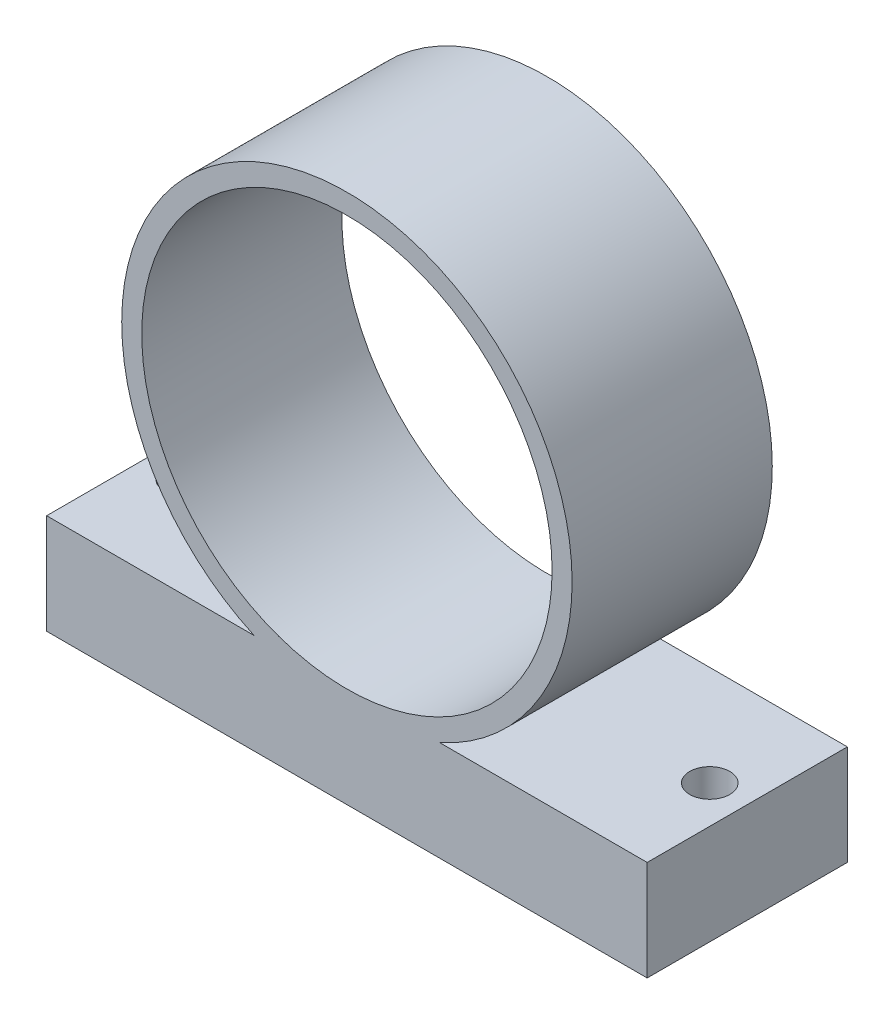
ISO-10303-21;
HEADER;
FILE_DESCRIPTION(('STEP AP214'),'2;1');
FILE_NAME('part.step','',(''),(''),'','','');
FILE_SCHEMA(('AUTOMOTIVE_DESIGN { 1 0 10303 214 1 1 1 1 }'));
ENDSEC;
DATA;
#1=APPLICATION_CONTEXT('core data for automotive mechanical design processes');
#2=APPLICATION_PROTOCOL_DEFINITION('international standard','automotive_design',2000,#1);
#3=PRODUCT_CONTEXT('',#1,'mechanical');
#4=PRODUCT('Part','Part','',(#3));
#5=PRODUCT_RELATED_PRODUCT_CATEGORY('part','',(#4));
#6=PRODUCT_DEFINITION_FORMATION('','',#4);
#7=PRODUCT_DEFINITION_CONTEXT('part definition',#1,'design');
#8=PRODUCT_DEFINITION('design','',#6,#7);
#9=PRODUCT_DEFINITION_SHAPE('','',#8);
#10=(LENGTH_UNIT() NAMED_UNIT(*) SI_UNIT(.MILLI.,.METRE.));
#11=(NAMED_UNIT(*) PLANE_ANGLE_UNIT() SI_UNIT($,.RADIAN.));
#12=(NAMED_UNIT(*) SI_UNIT($,.STERADIAN.) SOLID_ANGLE_UNIT());
#13=UNCERTAINTY_MEASURE_WITH_UNIT(LENGTH_MEASURE(1.E-05),#10,'distance_accuracy_value','');
#14=(GEOMETRIC_REPRESENTATION_CONTEXT(3) GLOBAL_UNCERTAINTY_ASSIGNED_CONTEXT((#13)) GLOBAL_UNIT_ASSIGNED_CONTEXT((#10,
#11,#12)) REPRESENTATION_CONTEXT('',''));
#15=CARTESIAN_POINT('',(0.,0.,0.));
#16=DIRECTION('',(0.,0.,1.));
#17=DIRECTION('',(1.,0.,0.));
#18=AXIS2_PLACEMENT_3D('',#15,#16,#17);
#19=CARTESIAN_POINT('',(0.,0.,20.));
#20=DIRECTION('',(0.,0.,-1.));
#21=DIRECTION('',(-1.,0.,0.));
#22=AXIS2_PLACEMENT_3D('',#19,#20,#21);
#23=CYLINDRICAL_SURFACE('',#22,22.5);
#24=DIRECTION('',(0.,0.,-1.));
#25=VECTOR('',#24,1.);
#26=CARTESIAN_POINT('',(-9.27361849549554,-20.5000000000001,20.));
#27=LINE('',#26,#25);
#28=CARTESIAN_POINT('',(-9.27361849549554,-20.5000000000001,20.));
#29=VERTEX_POINT('',#28);
#30=CARTESIAN_POINT('',(-9.27361849549554,-20.5000000000001,0.));
#31=VERTEX_POINT('',#30);
#32=EDGE_CURVE('E123',#29,#31,#27,.T.);
#33=ORIENTED_EDGE('',*,*,#32,.F.);
#34=CARTESIAN_POINT('',(0.,0.,20.));
#35=DIRECTION('',(0.,0.,1.));
#36=DIRECTION('',(1.,0.,0.));
#37=AXIS2_PLACEMENT_3D('',#34,#35,#36);
#38=CIRCLE('',#37,22.5);
#39=CARTESIAN_POINT('',(9.27361849549538,-20.5000000000001,20.));
#40=VERTEX_POINT('',#39);
#41=EDGE_CURVE('E11',#40,#29,#38,.T.);
#42=ORIENTED_EDGE('',*,*,#41,.F.);
#43=DIRECTION('',(0.,0.,-1.));
#44=VECTOR('',#43,1.);
#45=CARTESIAN_POINT('',(9.27361849549538,-20.5000000000001,20.));
#46=LINE('',#45,#44);
#47=CARTESIAN_POINT('',(9.27361849549538,-20.5000000000001,0.));
#48=VERTEX_POINT('',#47);
#49=EDGE_CURVE('E119',#48,#40,#46,.F.);
#50=ORIENTED_EDGE('',*,*,#49,.F.);
#51=CARTESIAN_POINT('',(0.,0.,0.));
#52=DIRECTION('',(0.,0.,1.));
#53=DIRECTION('',(1.,0.,0.));
#54=AXIS2_PLACEMENT_3D('',#51,#52,#53);
#55=CIRCLE('',#54,22.5);
#56=EDGE_CURVE('E48',#48,#31,#55,.T.);
#57=ORIENTED_EDGE('',*,*,#56,.T.);
#58=EDGE_LOOP('',(#33,#42,#50,#57));
#59=FACE_BOUND('',#58,.T.);
#60=ADVANCED_FACE('F39',(#59),#23,.T.);
#61=CARTESIAN_POINT('',(0.,0.,20.));
#62=DIRECTION('',(0.,0.,1.));
#63=DIRECTION('',(1.,0.,0.));
#64=AXIS2_PLACEMENT_3D('',#61,#62,#63);
#65=PLANE('',#64);
#66=CARTESIAN_POINT('',(0.,0.,20.));
#67=DIRECTION('',(0.,0.,1.));
#68=DIRECTION('',(1.,0.,0.));
#69=AXIS2_PLACEMENT_3D('',#66,#67,#68);
#70=CIRCLE('',#69,20.5);
#71=CARTESIAN_POINT('',(20.5,0.,20.));
#72=VERTEX_POINT('',#71);
#73=EDGE_CURVE('E132',#72,#72,#70,.T.);
#74=ORIENTED_EDGE('',*,*,#73,.F.);
#75=EDGE_LOOP('',(#74));
#76=FACE_BOUND('',#75,.T.);
#77=ORIENTED_EDGE('',*,*,#41,.T.);
#78=DIRECTION('',(-1.,0.,0.));
#79=VECTOR('',#78,1.);
#80=CARTESIAN_POINT('',(29.9999999999999,-20.5000000000002,20.));
#81=LINE('',#80,#79);
#82=CARTESIAN_POINT('',(-30.0000000000001,-20.5,20.));
#83=VERTEX_POINT('',#82);
#84=EDGE_CURVE('E102',#29,#83,#81,.T.);
#85=ORIENTED_EDGE('',*,*,#84,.T.);
#86=DIRECTION('',(0.,-1.,0.));
#87=VECTOR('',#86,1.);
#88=CARTESIAN_POINT('',(-30.0000000000001,-20.5,20.));
#89=LINE('',#88,#87);
#90=CARTESIAN_POINT('',(-30.0000000000001,-30.5,20.));
#91=VERTEX_POINT('',#90);
#92=EDGE_CURVE('E108',#83,#91,#89,.T.);
#93=ORIENTED_EDGE('',*,*,#92,.T.);
#94=DIRECTION('',(1.,0.,0.));
#95=VECTOR('',#94,1.);
#96=CARTESIAN_POINT('',(-30.0000000000001,-30.5,20.));
#97=LINE('',#96,#95);
#98=CARTESIAN_POINT('',(29.9999999999999,-30.5000000000002,20.));
#99=VERTEX_POINT('',#98);
#100=EDGE_CURVE('E103',#91,#99,#97,.T.);
#101=ORIENTED_EDGE('',*,*,#100,.T.);
#102=DIRECTION('',(0.,1.,0.));
#103=VECTOR('',#102,1.);
#104=CARTESIAN_POINT('',(29.9999999999999,-30.5000000000002,20.));
#105=LINE('',#104,#103);
#106=CARTESIAN_POINT('',(29.9999999999999,-20.5000000000002,20.));
#107=VERTEX_POINT('',#106);
#108=EDGE_CURVE('E90',#99,#107,#105,.T.);
#109=ORIENTED_EDGE('',*,*,#108,.T.);
#110=EDGE_CURVE('E158',#107,#40,#81,.T.);
#111=ORIENTED_EDGE('',*,*,#110,.T.);
#112=EDGE_LOOP('',(#77,#85,#93,#101,#109,#111));
#113=FACE_BOUND('',#112,.T.);
#114=ADVANCED_FACE('F106',(#76,#113),#65,.T.);
#115=CARTESIAN_POINT('',(0.,0.,0.));
#116=DIRECTION('',(0.,0.,1.));
#117=DIRECTION('',(1.,0.,0.));
#118=AXIS2_PLACEMENT_3D('',#115,#116,#117);
#119=PLANE('',#118);
#120=CARTESIAN_POINT('',(0.,0.,0.));
#121=DIRECTION('',(0.,0.,1.));
#122=DIRECTION('',(1.,0.,0.));
#123=AXIS2_PLACEMENT_3D('',#120,#121,#122);
#124=CIRCLE('',#123,20.5);
#125=CARTESIAN_POINT('',(20.5,0.,0.));
#126=VERTEX_POINT('',#125);
#127=EDGE_CURVE('E131',#126,#126,#124,.T.);
#128=ORIENTED_EDGE('',*,*,#127,.T.);
#129=EDGE_LOOP('',(#128));
#130=FACE_BOUND('',#129,.T.);
#131=DIRECTION('',(-1.,0.,0.));
#132=VECTOR('',#131,1.);
#133=CARTESIAN_POINT('',(29.9999999999999,-20.5000000000002,0.));
#134=LINE('',#133,#132);
#135=CARTESIAN_POINT('',(-30.0000000000001,-20.5,0.));
#136=VERTEX_POINT('',#135);
#137=EDGE_CURVE('E169',#31,#136,#134,.T.);
#138=ORIENTED_EDGE('',*,*,#137,.F.);
#139=ORIENTED_EDGE('',*,*,#56,.F.);
#140=CARTESIAN_POINT('',(29.9999999999999,-20.5000000000002,0.));
#141=VERTEX_POINT('',#140);
#142=EDGE_CURVE('E170',#141,#48,#134,.T.);
#143=ORIENTED_EDGE('',*,*,#142,.F.);
#144=DIRECTION('',(0.,1.,0.));
#145=VECTOR('',#144,1.);
#146=CARTESIAN_POINT('',(29.9999999999999,-30.5000000000002,0.));
#147=LINE('',#146,#145);
#148=CARTESIAN_POINT('',(29.9999999999999,-30.5000000000002,0.));
#149=VERTEX_POINT('',#148);
#150=EDGE_CURVE('E166',#149,#141,#147,.T.);
#151=ORIENTED_EDGE('',*,*,#150,.F.);
#152=DIRECTION('',(1.,0.,0.));
#153=VECTOR('',#152,1.);
#154=CARTESIAN_POINT('',(-30.0000000000001,-30.5,0.));
#155=LINE('',#154,#153);
#156=CARTESIAN_POINT('',(-30.0000000000001,-30.5,0.));
#157=VERTEX_POINT('',#156);
#158=EDGE_CURVE('E117',#157,#149,#155,.T.);
#159=ORIENTED_EDGE('',*,*,#158,.F.);
#160=DIRECTION('',(0.,-1.,0.));
#161=VECTOR('',#160,1.);
#162=CARTESIAN_POINT('',(-30.0000000000001,-20.5,0.));
#163=LINE('',#162,#161);
#164=EDGE_CURVE('E113',#136,#157,#163,.T.);
#165=ORIENTED_EDGE('',*,*,#164,.F.);
#166=EDGE_LOOP('',(#138,#139,#143,#151,#159,#165));
#167=FACE_BOUND('',#166,.T.);
#168=ADVANCED_FACE('F187',(#130,#167),#119,.F.);
#169=CARTESIAN_POINT('',(0.,0.,20.));
#170=DIRECTION('',(0.,0.,-1.));
#171=DIRECTION('',(-1.,0.,0.));
#172=AXIS2_PLACEMENT_3D('',#169,#170,#171);
#173=CYLINDRICAL_SURFACE('',#172,20.5);
#174=ORIENTED_EDGE('',*,*,#127,.F.);
#175=EDGE_LOOP('',(#174));
#176=FACE_BOUND('',#175,.T.);
#177=ORIENTED_EDGE('',*,*,#73,.T.);
#178=EDGE_LOOP('',(#177));
#179=FACE_BOUND('',#178,.T.);
#180=ADVANCED_FACE('F203',(#176,#179),#173,.F.);
#181=CARTESIAN_POINT('',(29.9999999999999,-20.5000000000002,20.));
#182=DIRECTION('',(0.,-1.,0.));
#183=DIRECTION('',(1.,0.,0.));
#184=AXIS2_PLACEMENT_3D('',#181,#182,#183);
#185=PLANE('',#184);
#186=CARTESIAN_POINT('',(-26.2500000000001,-20.5,10.));
#187=DIRECTION('',(0.,1.,0.));
#188=DIRECTION('',(-1.,0.,0.));
#189=AXIS2_PLACEMENT_3D('',#186,#187,#188);
#190=CIRCLE('',#189,2.);
#191=CARTESIAN_POINT('',(-28.2500000000001,-20.5,10.));
#192=VERTEX_POINT('',#191);
#193=EDGE_CURVE('E150',#192,#192,#190,.T.);
#194=ORIENTED_EDGE('',*,*,#193,.F.);
#195=EDGE_LOOP('',(#194));
#196=FACE_BOUND('',#195,.T.);
#197=ORIENTED_EDGE('',*,*,#84,.F.);
#198=ORIENTED_EDGE('',*,*,#32,.T.);
#199=ORIENTED_EDGE('',*,*,#137,.T.);
#200=DIRECTION('',(0.,0.,-1.));
#201=VECTOR('',#200,1.);
#202=CARTESIAN_POINT('',(-30.0000000000001,-20.5,20.));
#203=LINE('',#202,#201);
#204=EDGE_CURVE('E125',#83,#136,#203,.T.);
#205=ORIENTED_EDGE('',*,*,#204,.F.);
#206=EDGE_LOOP('',(#197,#198,#199,#205));
#207=FACE_BOUND('',#206,.T.);
#208=ADVANCED_FACE('F191',(#196,#207),#185,.F.);
#209=CARTESIAN_POINT('',(26.2499999999999,-20.5000000000002,10.));
#210=DIRECTION('',(0.,1.,0.));
#211=DIRECTION('',(-1.,0.,0.));
#212=AXIS2_PLACEMENT_3D('',#209,#210,#211);
#213=CIRCLE('',#212,2.);
#214=CARTESIAN_POINT('',(24.2499999999999,-20.5000000000002,10.));
#215=VERTEX_POINT('',#214);
#216=EDGE_CURVE('E143',#215,#215,#213,.T.);
#217=ORIENTED_EDGE('',*,*,#216,.F.);
#218=EDGE_LOOP('',(#217));
#219=FACE_BOUND('',#218,.T.);
#220=ORIENTED_EDGE('',*,*,#142,.T.);
#221=ORIENTED_EDGE('',*,*,#49,.T.);
#222=ORIENTED_EDGE('',*,*,#110,.F.);
#223=DIRECTION('',(0.,0.,-1.));
#224=VECTOR('',#223,1.);
#225=CARTESIAN_POINT('',(29.9999999999999,-20.5000000000002,20.));
#226=LINE('',#225,#224);
#227=EDGE_CURVE('E97',#107,#141,#226,.T.);
#228=ORIENTED_EDGE('',*,*,#227,.T.);
#229=EDGE_LOOP('',(#220,#221,#222,#228));
#230=FACE_BOUND('',#229,.T.);
#231=ADVANCED_FACE('F190',(#219,#230),#185,.F.);
#232=CARTESIAN_POINT('',(-30.0000000000001,-30.5,20.));
#233=DIRECTION('',(0.,1.,0.));
#234=DIRECTION('',(-1.,0.,0.));
#235=AXIS2_PLACEMENT_3D('',#232,#233,#234);
#236=PLANE('',#235);
#237=CARTESIAN_POINT('',(26.2499999999999,-30.5000000000002,10.));
#238=DIRECTION('',(0.,1.,0.));
#239=DIRECTION('',(-1.,0.,0.));
#240=AXIS2_PLACEMENT_3D('',#237,#238,#239);
#241=CIRCLE('',#240,2.);
#242=CARTESIAN_POINT('',(24.2499999999999,-30.5000000000002,10.));
#243=VERTEX_POINT('',#242);
#244=EDGE_CURVE('E42',#243,#243,#241,.T.);
#245=ORIENTED_EDGE('',*,*,#244,.T.);
#246=EDGE_LOOP('',(#245));
#247=FACE_BOUND('',#246,.T.);
#248=CARTESIAN_POINT('',(-26.2500000000001,-30.5,10.));
#249=DIRECTION('',(0.,1.,0.));
#250=DIRECTION('',(-1.,0.,0.));
#251=AXIS2_PLACEMENT_3D('',#248,#249,#250);
#252=CIRCLE('',#251,2.);
#253=CARTESIAN_POINT('',(-28.2500000000001,-30.5,10.));
#254=VERTEX_POINT('',#253);
#255=EDGE_CURVE('E140',#254,#254,#252,.T.);
#256=ORIENTED_EDGE('',*,*,#255,.T.);
#257=EDGE_LOOP('',(#256));
#258=FACE_BOUND('',#257,.T.);
#259=ORIENTED_EDGE('',*,*,#158,.T.);
#260=DIRECTION('',(0.,0.,-1.));
#261=VECTOR('',#260,1.);
#262=CARTESIAN_POINT('',(29.9999999999999,-30.5000000000002,20.));
#263=LINE('',#262,#261);
#264=EDGE_CURVE('E94',#99,#149,#263,.T.);
#265=ORIENTED_EDGE('',*,*,#264,.F.);
#266=ORIENTED_EDGE('',*,*,#100,.F.);
#267=DIRECTION('',(0.,0.,-1.));
#268=VECTOR('',#267,1.);
#269=CARTESIAN_POINT('',(-30.0000000000001,-30.5,20.));
#270=LINE('',#269,#268);
#271=EDGE_CURVE('E163',#91,#157,#270,.T.);
#272=ORIENTED_EDGE('',*,*,#271,.T.);
#273=EDGE_LOOP('',(#259,#265,#266,#272));
#274=FACE_BOUND('',#273,.T.);
#275=ADVANCED_FACE('F115',(#247,#258,#274),#236,.F.);
#276=CARTESIAN_POINT('',(29.9999999999999,-30.5000000000002,20.));
#277=DIRECTION('',(-1.,0.,0.));
#278=DIRECTION('',(0.,0.,1.));
#279=AXIS2_PLACEMENT_3D('',#276,#277,#278);
#280=PLANE('',#279);
#281=ORIENTED_EDGE('',*,*,#150,.T.);
#282=ORIENTED_EDGE('',*,*,#227,.F.);
#283=ORIENTED_EDGE('',*,*,#108,.F.);
#284=ORIENTED_EDGE('',*,*,#264,.T.);
#285=EDGE_LOOP('',(#281,#282,#283,#284));
#286=FACE_BOUND('',#285,.T.);
#287=ADVANCED_FACE('F92',(#286),#280,.F.);
#288=CARTESIAN_POINT('',(-30.0000000000001,-20.5,20.));
#289=DIRECTION('',(1.,0.,0.));
#290=DIRECTION('',(0.,0.,-1.));
#291=AXIS2_PLACEMENT_3D('',#288,#289,#290);
#292=PLANE('',#291);
#293=ORIENTED_EDGE('',*,*,#164,.T.);
#294=ORIENTED_EDGE('',*,*,#271,.F.);
#295=ORIENTED_EDGE('',*,*,#92,.F.);
#296=ORIENTED_EDGE('',*,*,#204,.T.);
#297=EDGE_LOOP('',(#293,#294,#295,#296));
#298=FACE_BOUND('',#297,.T.);
#299=ADVANCED_FACE('F182',(#298),#292,.F.);
#300=CARTESIAN_POINT('',(-26.2500000000002,-40.5,10.));
#301=DIRECTION('',(0.,1.,0.));
#302=DIRECTION('',(-1.,0.,0.));
#303=AXIS2_PLACEMENT_3D('',#300,#301,#302);
#304=CYLINDRICAL_SURFACE('',#303,2.);
#305=ORIENTED_EDGE('',*,*,#193,.T.);
#306=EDGE_LOOP('',(#305));
#307=FACE_BOUND('',#306,.T.);
#308=ORIENTED_EDGE('',*,*,#255,.F.);
#309=EDGE_LOOP('',(#308));
#310=FACE_BOUND('',#309,.T.);
#311=ADVANCED_FACE('F220',(#307,#310),#304,.F.);
#312=CARTESIAN_POINT('',(26.2499999999998,-40.5000000000002,10.));
#313=DIRECTION('',(0.,1.,0.));
#314=DIRECTION('',(-1.,0.,0.));
#315=AXIS2_PLACEMENT_3D('',#312,#313,#314);
#316=CYLINDRICAL_SURFACE('',#315,2.);
#317=ORIENTED_EDGE('',*,*,#216,.T.);
#318=EDGE_LOOP('',(#317));
#319=FACE_BOUND('',#318,.T.);
#320=ORIENTED_EDGE('',*,*,#244,.F.);
#321=EDGE_LOOP('',(#320));
#322=FACE_BOUND('',#321,.T.);
#323=ADVANCED_FACE('F223',(#319,#322),#316,.F.);
#324=CLOSED_SHELL('',(#60,#114,#168,#180,#208,#231,#275,#287,#299,#311,#323));
#325=MANIFOLD_SOLID_BREP('B2',#324);
#326=ADVANCED_BREP_SHAPE_REPRESENTATION('',(#18,#325),#14);
#327=SHAPE_DEFINITION_REPRESENTATION(#9,#326);
ENDSEC;
END-ISO-10303-21;
